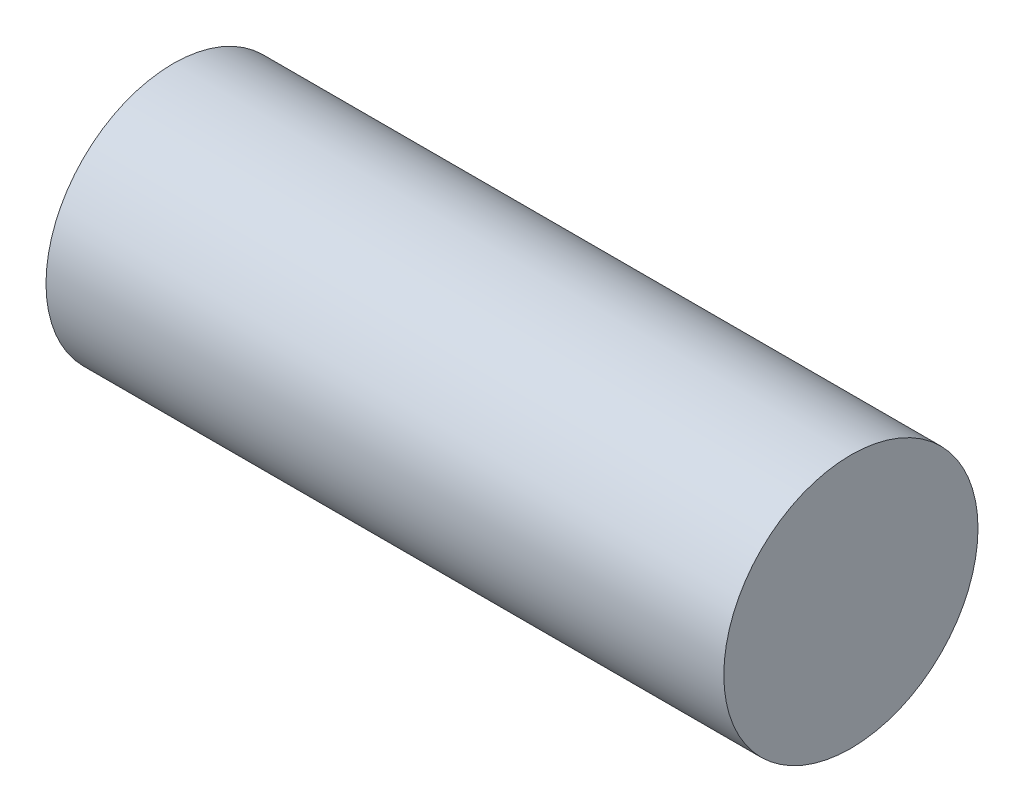
ISO-10303-21;
HEADER;
FILE_DESCRIPTION(('STEP AP214'),'2;1');
FILE_NAME('part.step','',(''),(''),'','','');
FILE_SCHEMA(('AUTOMOTIVE_DESIGN { 1 0 10303 214 1 1 1 1 }'));
ENDSEC;
DATA;
#1=APPLICATION_CONTEXT('core data for automotive mechanical design processes');
#2=APPLICATION_PROTOCOL_DEFINITION('international standard','automotive_design',2000,#1);
#3=PRODUCT_CONTEXT('',#1,'mechanical');
#4=PRODUCT('Part','Part','',(#3));
#5=PRODUCT_RELATED_PRODUCT_CATEGORY('part','',(#4));
#6=PRODUCT_DEFINITION_FORMATION('','',#4);
#7=PRODUCT_DEFINITION_CONTEXT('part definition',#1,'design');
#8=PRODUCT_DEFINITION('design','',#6,#7);
#9=PRODUCT_DEFINITION_SHAPE('','',#8);
#10=(LENGTH_UNIT() NAMED_UNIT(*) SI_UNIT(.MILLI.,.METRE.));
#11=(NAMED_UNIT(*) PLANE_ANGLE_UNIT() SI_UNIT($,.RADIAN.));
#12=(NAMED_UNIT(*) SI_UNIT($,.STERADIAN.) SOLID_ANGLE_UNIT());
#13=UNCERTAINTY_MEASURE_WITH_UNIT(LENGTH_MEASURE(1.E-05),#10,'distance_accuracy_value','');
#14=(GEOMETRIC_REPRESENTATION_CONTEXT(3) GLOBAL_UNCERTAINTY_ASSIGNED_CONTEXT((#13)) GLOBAL_UNIT_ASSIGNED_CONTEXT((#10,
#11,#12)) REPRESENTATION_CONTEXT('',''));
#15=CARTESIAN_POINT('',(0.,0.,0.));
#16=DIRECTION('',(0.,0.,1.));
#17=DIRECTION('',(1.,0.,0.));
#18=AXIS2_PLACEMENT_3D('',#15,#16,#17);
#19=CARTESIAN_POINT('',(32.,0.,0.));
#20=DIRECTION('',(-1.,0.,0.));
#21=DIRECTION('',(0.,0.,1.));
#22=AXIS2_PLACEMENT_3D('',#19,#20,#21);
#23=CYLINDRICAL_SURFACE('',#22,6.);
#24=CARTESIAN_POINT('',(32.,0.,0.));
#25=DIRECTION('',(1.,0.,0.));
#26=DIRECTION('',(0.,0.,-1.));
#27=AXIS2_PLACEMENT_3D('',#24,#25,#26);
#28=CIRCLE('',#27,6.);
#29=CARTESIAN_POINT('',(32.,0.,-6.));
#30=VERTEX_POINT('',#29);
#31=EDGE_CURVE('E10',#30,#30,#28,.T.);
#32=ORIENTED_EDGE('',*,*,#31,.F.);
#33=EDGE_LOOP('',(#32));
#34=FACE_BOUND('',#33,.T.);
#35=CARTESIAN_POINT('',(0.,0.,0.));
#36=DIRECTION('',(1.,0.,0.));
#37=DIRECTION('',(0.,0.,-1.));
#38=AXIS2_PLACEMENT_3D('',#35,#36,#37);
#39=CIRCLE('',#38,6.);
#40=CARTESIAN_POINT('',(0.,0.,-6.));
#41=VERTEX_POINT('',#40);
#42=EDGE_CURVE('E45',#41,#41,#39,.T.);
#43=ORIENTED_EDGE('',*,*,#42,.T.);
#44=EDGE_LOOP('',(#43));
#45=FACE_BOUND('',#44,.T.);
#46=ADVANCED_FACE('F39',(#34,#45),#23,.T.);
#47=CARTESIAN_POINT('',(32.,0.,0.));
#48=DIRECTION('',(1.,0.,0.));
#49=DIRECTION('',(0.,0.,-1.));
#50=AXIS2_PLACEMENT_3D('',#47,#48,#49);
#51=PLANE('',#50);
#52=ORIENTED_EDGE('',*,*,#31,.T.);
#53=EDGE_LOOP('',(#52));
#54=FACE_BOUND('',#53,.T.);
#55=ADVANCED_FACE('F53',(#54),#51,.T.);
#56=CARTESIAN_POINT('',(0.,0.,0.));
#57=DIRECTION('',(1.,0.,0.));
#58=DIRECTION('',(0.,0.,-1.));
#59=AXIS2_PLACEMENT_3D('',#56,#57,#58);
#60=PLANE('',#59);
#61=ORIENTED_EDGE('',*,*,#42,.F.);
#62=EDGE_LOOP('',(#61));
#63=FACE_BOUND('',#62,.T.);
#64=ADVANCED_FACE('F55',(#63),#60,.F.);
#65=CLOSED_SHELL('',(#46,#55,#64));
#66=MANIFOLD_SOLID_BREP('B2',#65);
#67=ADVANCED_BREP_SHAPE_REPRESENTATION('',(#18,#66),#14);
#68=SHAPE_DEFINITION_REPRESENTATION(#9,#67);
ENDSEC;
END-ISO-10303-21;
